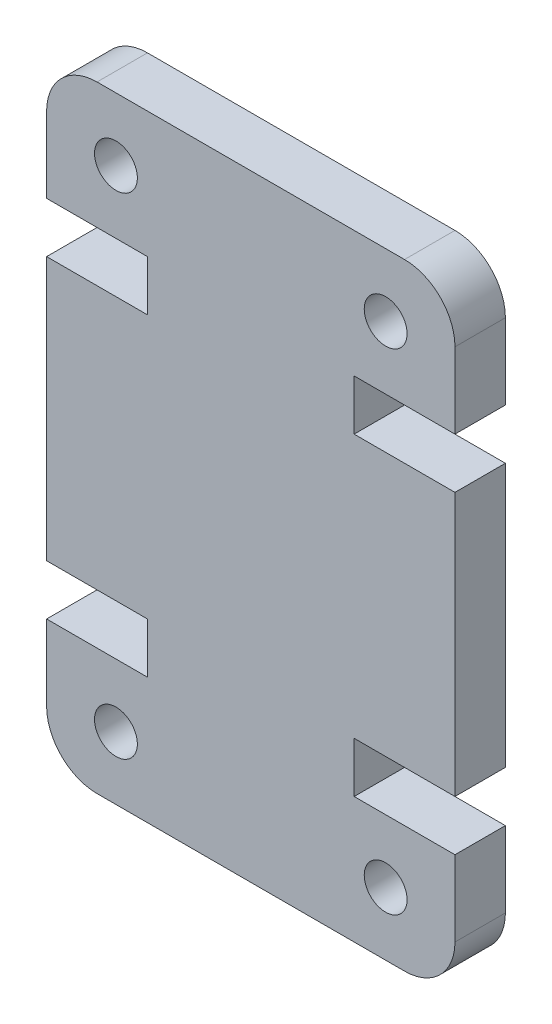
ISO-10303-21;
HEADER;
FILE_DESCRIPTION(('STEP AP214'),'2;1');
FILE_NAME('part.step','',(''),(''),'','','');
FILE_SCHEMA(('AUTOMOTIVE_DESIGN { 1 0 10303 214 1 1 1 1 }'));
ENDSEC;
DATA;
#1=APPLICATION_CONTEXT('core data for automotive mechanical design processes');
#2=APPLICATION_PROTOCOL_DEFINITION('international standard','automotive_design',2000,#1);
#3=PRODUCT_CONTEXT('',#1,'mechanical');
#4=PRODUCT('Part','Part','',(#3));
#5=PRODUCT_RELATED_PRODUCT_CATEGORY('part','',(#4));
#6=PRODUCT_DEFINITION_FORMATION('','',#4);
#7=PRODUCT_DEFINITION_CONTEXT('part definition',#1,'design');
#8=PRODUCT_DEFINITION('design','',#6,#7);
#9=PRODUCT_DEFINITION_SHAPE('','',#8);
#10=(LENGTH_UNIT() NAMED_UNIT(*) SI_UNIT(.MILLI.,.METRE.));
#11=(NAMED_UNIT(*) PLANE_ANGLE_UNIT() SI_UNIT($,.RADIAN.));
#12=(NAMED_UNIT(*) SI_UNIT($,.STERADIAN.) SOLID_ANGLE_UNIT());
#13=UNCERTAINTY_MEASURE_WITH_UNIT(LENGTH_MEASURE(1.E-05),#10,'distance_accuracy_value','');
#14=(GEOMETRIC_REPRESENTATION_CONTEXT(3) GLOBAL_UNCERTAINTY_ASSIGNED_CONTEXT((#13)) GLOBAL_UNIT_ASSIGNED_CONTEXT((#10,
#11,#12)) REPRESENTATION_CONTEXT('',''));
#15=CARTESIAN_POINT('',(0.,0.,0.));
#16=DIRECTION('',(0.,0.,1.));
#17=DIRECTION('',(1.,0.,0.));
#18=AXIS2_PLACEMENT_3D('',#15,#16,#17);
#19=CARTESIAN_POINT('',(14.2,2.,4.));
#20=DIRECTION('',(0.,0.,-1.));
#21=DIRECTION('',(-1.,0.,0.));
#22=AXIS2_PLACEMENT_3D('',#19,#20,#21);
#23=CYLINDRICAL_SURFACE('',#22,2.);
#24=CARTESIAN_POINT('',(14.2,2.,2.));
#25=DIRECTION('',(0.,0.,-1.));
#26=DIRECTION('',(-1.,0.,0.));
#27=AXIS2_PLACEMENT_3D('',#24,#25,#26);
#28=CIRCLE('',#27,2.);
#29=CARTESIAN_POINT('',(16.2,2.00000000000001,2.));
#30=VERTEX_POINT('',#29);
#31=CARTESIAN_POINT('',(14.2,0.,2.));
#32=VERTEX_POINT('',#31);
#33=EDGE_CURVE('E47',#30,#32,#28,.T.);
#34=ORIENTED_EDGE('',*,*,#33,.F.);
#35=DIRECTION('',(0.,0.,-1.));
#36=VECTOR('',#35,1.);
#37=CARTESIAN_POINT('',(16.2,2.,4.));
#38=LINE('',#37,#36);
#39=CARTESIAN_POINT('',(16.2,2.,4.));
#40=VERTEX_POINT('',#39);
#41=EDGE_CURVE('E11',#40,#30,#38,.T.);
#42=ORIENTED_EDGE('',*,*,#41,.F.);
#43=CARTESIAN_POINT('',(14.2,2.,4.));
#44=DIRECTION('',(0.,0.,1.));
#45=DIRECTION('',(-1.,0.,0.));
#46=AXIS2_PLACEMENT_3D('',#43,#44,#45);
#47=CIRCLE('',#46,2.);
#48=CARTESIAN_POINT('',(14.2,0.,4.));
#49=VERTEX_POINT('',#48);
#50=EDGE_CURVE('E352',#49,#40,#47,.T.);
#51=ORIENTED_EDGE('',*,*,#50,.F.);
#52=DIRECTION('',(0.,0.,-1.));
#53=VECTOR('',#52,1.);
#54=CARTESIAN_POINT('',(14.2,0.,4.));
#55=LINE('',#54,#53);
#56=EDGE_CURVE('E213',#49,#32,#55,.T.);
#57=ORIENTED_EDGE('',*,*,#56,.T.);
#58=EDGE_LOOP('',(#34,#42,#51,#57));
#59=FACE_BOUND('',#58,.T.);
#60=ADVANCED_FACE('F32',(#59),#23,.T.);
#61=CARTESIAN_POINT('',(16.2,5.00000000000014,4.));
#62=DIRECTION('',(-1.,0.,0.));
#63=DIRECTION('',(0.,0.,1.));
#64=AXIS2_PLACEMENT_3D('',#61,#62,#63);
#65=PLANE('',#64);
#66=DIRECTION('',(0.,-1.,0.));
#67=VECTOR('',#66,1.);
#68=CARTESIAN_POINT('',(16.2,24.45,2.));
#69=LINE('',#68,#67);
#70=CARTESIAN_POINT('',(16.2,5.00000000000014,2.));
#71=VERTEX_POINT('',#70);
#72=EDGE_CURVE('E289',#71,#30,#69,.T.);
#73=ORIENTED_EDGE('',*,*,#72,.F.);
#74=DIRECTION('',(0.,0.,-1.));
#75=VECTOR('',#74,1.);
#76=CARTESIAN_POINT('',(16.2,5.00000000000014,4.));
#77=LINE('',#76,#75);
#78=CARTESIAN_POINT('',(16.2,5.00000000000014,4.));
#79=VERTEX_POINT('',#78);
#80=EDGE_CURVE('E40',#79,#71,#77,.T.);
#81=ORIENTED_EDGE('',*,*,#80,.F.);
#82=DIRECTION('',(0.,1.,0.));
#83=VECTOR('',#82,1.);
#84=CARTESIAN_POINT('',(16.2,5.00000000000014,4.));
#85=LINE('',#84,#83);
#86=EDGE_CURVE('E288',#40,#79,#85,.T.);
#87=ORIENTED_EDGE('',*,*,#86,.F.);
#88=ORIENTED_EDGE('',*,*,#41,.T.);
#89=EDGE_LOOP('',(#73,#81,#87,#88));
#90=FACE_BOUND('',#89,.T.);
#91=ADVANCED_FACE('F287',(#90),#65,.F.);
#92=CARTESIAN_POINT('',(12.2,5.00000000000014,4.));
#93=DIRECTION('',(0.,-1.,0.));
#94=DIRECTION('',(0.,0.,-1.));
#95=AXIS2_PLACEMENT_3D('',#92,#93,#94);
#96=PLANE('',#95);
#97=DIRECTION('',(1.,0.,0.));
#98=VECTOR('',#97,1.);
#99=CARTESIAN_POINT('',(12.2,5.00000000000014,2.));
#100=LINE('',#99,#98);
#101=CARTESIAN_POINT('',(12.2,5.00000000000014,2.));
#102=VERTEX_POINT('',#101);
#103=EDGE_CURVE('E283',#102,#71,#100,.T.);
#104=ORIENTED_EDGE('',*,*,#103,.F.);
#105=DIRECTION('',(0.,0.,-1.));
#106=VECTOR('',#105,1.);
#107=CARTESIAN_POINT('',(12.2,5.00000000000014,4.));
#108=LINE('',#107,#106);
#109=CARTESIAN_POINT('',(12.2,5.00000000000014,4.));
#110=VERTEX_POINT('',#109);
#111=EDGE_CURVE('E273',#110,#102,#108,.T.);
#112=ORIENTED_EDGE('',*,*,#111,.F.);
#113=DIRECTION('',(-1.,0.,0.));
#114=VECTOR('',#113,1.);
#115=CARTESIAN_POINT('',(12.2,5.00000000000014,4.));
#116=LINE('',#115,#114);
#117=EDGE_CURVE('E284',#79,#110,#116,.T.);
#118=ORIENTED_EDGE('',*,*,#117,.F.);
#119=ORIENTED_EDGE('',*,*,#80,.T.);
#120=EDGE_LOOP('',(#104,#112,#118,#119));
#121=FACE_BOUND('',#120,.T.);
#122=ADVANCED_FACE('F281',(#121),#96,.F.);
#123=CARTESIAN_POINT('',(12.2,7.00000000000014,4.));
#124=DIRECTION('',(-1.,0.,0.));
#125=DIRECTION('',(0.,0.,1.));
#126=AXIS2_PLACEMENT_3D('',#123,#124,#125);
#127=PLANE('',#126);
#128=DIRECTION('',(0.,-1.,0.));
#129=VECTOR('',#128,1.);
#130=CARTESIAN_POINT('',(12.2,7.00000000000014,2.));
#131=LINE('',#130,#129);
#132=CARTESIAN_POINT('',(12.2,7.00000000000014,2.));
#133=VERTEX_POINT('',#132);
#134=EDGE_CURVE('E336',#133,#102,#131,.T.);
#135=ORIENTED_EDGE('',*,*,#134,.F.);
#136=DIRECTION('',(0.,0.,-1.));
#137=VECTOR('',#136,1.);
#138=CARTESIAN_POINT('',(12.2,7.00000000000014,4.));
#139=LINE('',#138,#137);
#140=CARTESIAN_POINT('',(12.2,7.00000000000014,4.));
#141=VERTEX_POINT('',#140);
#142=EDGE_CURVE('E270',#141,#133,#139,.T.);
#143=ORIENTED_EDGE('',*,*,#142,.F.);
#144=DIRECTION('',(0.,1.,0.));
#145=VECTOR('',#144,1.);
#146=CARTESIAN_POINT('',(12.2,7.00000000000014,4.));
#147=LINE('',#146,#145);
#148=EDGE_CURVE('E356',#110,#141,#147,.T.);
#149=ORIENTED_EDGE('',*,*,#148,.F.);
#150=ORIENTED_EDGE('',*,*,#111,.T.);
#151=EDGE_LOOP('',(#135,#143,#149,#150));
#152=FACE_BOUND('',#151,.T.);
#153=ADVANCED_FACE('F459',(#152),#127,.F.);
#154=CARTESIAN_POINT('',(16.2,7.00000000000014,4.));
#155=DIRECTION('',(0.,1.,0.));
#156=DIRECTION('',(-1.,0.,0.));
#157=AXIS2_PLACEMENT_3D('',#154,#155,#156);
#158=PLANE('',#157);
#159=DIRECTION('',(-1.,0.,0.));
#160=VECTOR('',#159,1.);
#161=CARTESIAN_POINT('',(16.2,7.00000000000014,2.));
#162=LINE('',#161,#160);
#163=CARTESIAN_POINT('',(16.2,7.00000000000014,2.));
#164=VERTEX_POINT('',#163);
#165=EDGE_CURVE('E334',#164,#133,#162,.T.);
#166=ORIENTED_EDGE('',*,*,#165,.F.);
#167=DIRECTION('',(0.,0.,-1.));
#168=VECTOR('',#167,1.);
#169=CARTESIAN_POINT('',(16.2,7.00000000000014,4.));
#170=LINE('',#169,#168);
#171=CARTESIAN_POINT('',(16.2,7.00000000000014,4.));
#172=VERTEX_POINT('',#171);
#173=EDGE_CURVE('E267',#172,#164,#170,.T.);
#174=ORIENTED_EDGE('',*,*,#173,.F.);
#175=DIRECTION('',(1.,0.,0.));
#176=VECTOR('',#175,1.);
#177=CARTESIAN_POINT('',(16.2,7.00000000000014,4.));
#178=LINE('',#177,#176);
#179=EDGE_CURVE('E358',#141,#172,#178,.T.);
#180=ORIENTED_EDGE('',*,*,#179,.F.);
#181=ORIENTED_EDGE('',*,*,#142,.T.);
#182=EDGE_LOOP('',(#166,#174,#180,#181));
#183=FACE_BOUND('',#182,.T.);
#184=ADVANCED_FACE('F455',(#183),#158,.F.);
#185=CARTESIAN_POINT('',(16.2,17.4499999999999,4.));
#186=DIRECTION('',(-1.,0.,0.));
#187=DIRECTION('',(0.,0.,1.));
#188=AXIS2_PLACEMENT_3D('',#185,#186,#187);
#189=PLANE('',#188);
#190=CARTESIAN_POINT('',(16.2,17.4499999999999,2.));
#191=VERTEX_POINT('',#190);
#192=EDGE_CURVE('E291',#191,#164,#69,.T.);
#193=ORIENTED_EDGE('',*,*,#192,.F.);
#194=DIRECTION('',(0.,0.,-1.));
#195=VECTOR('',#194,1.);
#196=CARTESIAN_POINT('',(16.2,17.4499999999999,4.));
#197=LINE('',#196,#195);
#198=CARTESIAN_POINT('',(16.2,17.4499999999999,4.));
#199=VERTEX_POINT('',#198);
#200=EDGE_CURVE('E264',#199,#191,#197,.T.);
#201=ORIENTED_EDGE('',*,*,#200,.F.);
#202=DIRECTION('',(0.,1.,0.));
#203=VECTOR('',#202,1.);
#204=CARTESIAN_POINT('',(16.2,17.4499999999999,4.));
#205=LINE('',#204,#203);
#206=EDGE_CURVE('E360',#172,#199,#205,.T.);
#207=ORIENTED_EDGE('',*,*,#206,.F.);
#208=ORIENTED_EDGE('',*,*,#173,.T.);
#209=EDGE_LOOP('',(#193,#201,#207,#208));
#210=FACE_BOUND('',#209,.T.);
#211=ADVANCED_FACE('F450',(#210),#189,.F.);
#212=CARTESIAN_POINT('',(16.2,17.4499999999999,4.));
#213=DIRECTION('',(0.,-1.,0.));
#214=DIRECTION('',(1.,0.,0.));
#215=AXIS2_PLACEMENT_3D('',#212,#213,#214);
#216=PLANE('',#215);
#217=DIRECTION('',(1.,0.,0.));
#218=VECTOR('',#217,1.);
#219=CARTESIAN_POINT('',(16.2,17.4499999999999,2.));
#220=LINE('',#219,#218);
#221=CARTESIAN_POINT('',(12.2,17.4499999999999,2.));
#222=VERTEX_POINT('',#221);
#223=EDGE_CURVE('E332',#222,#191,#220,.T.);
#224=ORIENTED_EDGE('',*,*,#223,.F.);
#225=DIRECTION('',(0.,0.,-1.));
#226=VECTOR('',#225,1.);
#227=CARTESIAN_POINT('',(12.2,17.4499999999999,4.));
#228=LINE('',#227,#226);
#229=CARTESIAN_POINT('',(12.2,17.4499999999999,4.));
#230=VERTEX_POINT('',#229);
#231=EDGE_CURVE('E261',#230,#222,#228,.T.);
#232=ORIENTED_EDGE('',*,*,#231,.F.);
#233=DIRECTION('',(-1.,0.,0.));
#234=VECTOR('',#233,1.);
#235=CARTESIAN_POINT('',(16.2,17.4499999999999,4.));
#236=LINE('',#235,#234);
#237=EDGE_CURVE('E362',#199,#230,#236,.T.);
#238=ORIENTED_EDGE('',*,*,#237,.F.);
#239=ORIENTED_EDGE('',*,*,#200,.T.);
#240=EDGE_LOOP('',(#224,#232,#238,#239));
#241=FACE_BOUND('',#240,.T.);
#242=ADVANCED_FACE('F445',(#241),#216,.F.);
#243=CARTESIAN_POINT('',(12.2,17.4499999999999,4.));
#244=DIRECTION('',(-1.,0.,0.));
#245=DIRECTION('',(0.,0.,1.));
#246=AXIS2_PLACEMENT_3D('',#243,#244,#245);
#247=PLANE('',#246);
#248=DIRECTION('',(0.,-1.,0.));
#249=VECTOR('',#248,1.);
#250=CARTESIAN_POINT('',(12.2,17.4499999999999,2.));
#251=LINE('',#250,#249);
#252=CARTESIAN_POINT('',(12.2,19.4499999999999,2.));
#253=VERTEX_POINT('',#252);
#254=EDGE_CURVE('E330',#253,#222,#251,.T.);
#255=ORIENTED_EDGE('',*,*,#254,.F.);
#256=DIRECTION('',(0.,0.,-1.));
#257=VECTOR('',#256,1.);
#258=CARTESIAN_POINT('',(12.2,19.4499999999999,4.));
#259=LINE('',#258,#257);
#260=CARTESIAN_POINT('',(12.2,19.4499999999999,4.));
#261=VERTEX_POINT('',#260);
#262=EDGE_CURVE('E258',#261,#253,#259,.T.);
#263=ORIENTED_EDGE('',*,*,#262,.F.);
#264=DIRECTION('',(0.,1.,0.));
#265=VECTOR('',#264,1.);
#266=CARTESIAN_POINT('',(12.2,17.4499999999999,4.));
#267=LINE('',#266,#265);
#268=EDGE_CURVE('E364',#230,#261,#267,.T.);
#269=ORIENTED_EDGE('',*,*,#268,.F.);
#270=ORIENTED_EDGE('',*,*,#231,.T.);
#271=EDGE_LOOP('',(#255,#263,#269,#270));
#272=FACE_BOUND('',#271,.T.);
#273=ADVANCED_FACE('F440',(#272),#247,.F.);
#274=CARTESIAN_POINT('',(12.2,19.4499999999999,4.));
#275=DIRECTION('',(0.,1.,0.));
#276=DIRECTION('',(0.,0.,1.));
#277=AXIS2_PLACEMENT_3D('',#274,#275,#276);
#278=PLANE('',#277);
#279=DIRECTION('',(-1.,0.,0.));
#280=VECTOR('',#279,1.);
#281=CARTESIAN_POINT('',(12.2,19.4499999999999,2.));
#282=LINE('',#281,#280);
#283=CARTESIAN_POINT('',(16.2,19.4499999999999,2.));
#284=VERTEX_POINT('',#283);
#285=EDGE_CURVE('E328',#284,#253,#282,.T.);
#286=ORIENTED_EDGE('',*,*,#285,.F.);
#287=DIRECTION('',(0.,0.,-1.));
#288=VECTOR('',#287,1.);
#289=CARTESIAN_POINT('',(16.2,19.4499999999999,4.));
#290=LINE('',#289,#288);
#291=CARTESIAN_POINT('',(16.2,19.4499999999999,4.));
#292=VERTEX_POINT('',#291);
#293=EDGE_CURVE('E255',#292,#284,#290,.T.);
#294=ORIENTED_EDGE('',*,*,#293,.F.);
#295=DIRECTION('',(1.,0.,0.));
#296=VECTOR('',#295,1.);
#297=CARTESIAN_POINT('',(12.2,19.4499999999999,4.));
#298=LINE('',#297,#296);
#299=EDGE_CURVE('E366',#261,#292,#298,.T.);
#300=ORIENTED_EDGE('',*,*,#299,.F.);
#301=ORIENTED_EDGE('',*,*,#262,.T.);
#302=EDGE_LOOP('',(#286,#294,#300,#301));
#303=FACE_BOUND('',#302,.T.);
#304=ADVANCED_FACE('F435',(#303),#278,.F.);
#305=CARTESIAN_POINT('',(16.2,19.4499999999999,4.));
#306=DIRECTION('',(-1.,0.,0.));
#307=DIRECTION('',(0.,0.,1.));
#308=AXIS2_PLACEMENT_3D('',#305,#306,#307);
#309=PLANE('',#308);
#310=CARTESIAN_POINT('',(16.2,22.45,2.));
#311=VERTEX_POINT('',#310);
#312=EDGE_CURVE('E294',#311,#284,#69,.T.);
#313=ORIENTED_EDGE('',*,*,#312,.F.);
#314=DIRECTION('',(0.,0.,-1.));
#315=VECTOR('',#314,1.);
#316=CARTESIAN_POINT('',(16.2,22.45,4.));
#317=LINE('',#316,#315);
#318=CARTESIAN_POINT('',(16.2,22.45,4.));
#319=VERTEX_POINT('',#318);
#320=EDGE_CURVE('E252',#319,#311,#317,.T.);
#321=ORIENTED_EDGE('',*,*,#320,.F.);
#322=DIRECTION('',(0.,1.,0.));
#323=VECTOR('',#322,1.);
#324=CARTESIAN_POINT('',(16.2,19.4499999999999,4.));
#325=LINE('',#324,#323);
#326=EDGE_CURVE('E368',#292,#319,#325,.T.);
#327=ORIENTED_EDGE('',*,*,#326,.F.);
#328=ORIENTED_EDGE('',*,*,#293,.T.);
#329=EDGE_LOOP('',(#313,#321,#327,#328));
#330=FACE_BOUND('',#329,.T.);
#331=ADVANCED_FACE('F431',(#330),#309,.F.);
#332=CARTESIAN_POINT('',(14.2,22.45,4.));
#333=DIRECTION('',(0.,0.,-1.));
#334=DIRECTION('',(-1.,0.,0.));
#335=AXIS2_PLACEMENT_3D('',#332,#333,#334);
#336=CYLINDRICAL_SURFACE('',#335,2.);
#337=CARTESIAN_POINT('',(14.2,22.45,2.));
#338=DIRECTION('',(0.,0.,-1.));
#339=DIRECTION('',(-1.,0.,0.));
#340=AXIS2_PLACEMENT_3D('',#337,#338,#339);
#341=CIRCLE('',#340,2.);
#342=CARTESIAN_POINT('',(14.2,24.45,2.));
#343=VERTEX_POINT('',#342);
#344=EDGE_CURVE('E326',#343,#311,#341,.T.);
#345=ORIENTED_EDGE('',*,*,#344,.F.);
#346=DIRECTION('',(0.,0.,-1.));
#347=VECTOR('',#346,1.);
#348=CARTESIAN_POINT('',(14.2,24.45,4.));
#349=LINE('',#348,#347);
#350=CARTESIAN_POINT('',(14.2,24.45,4.));
#351=VERTEX_POINT('',#350);
#352=EDGE_CURVE('E249',#351,#343,#349,.T.);
#353=ORIENTED_EDGE('',*,*,#352,.F.);
#354=CARTESIAN_POINT('',(14.2,22.45,4.));
#355=DIRECTION('',(0.,0.,1.));
#356=DIRECTION('',(1.,0.,0.));
#357=AXIS2_PLACEMENT_3D('',#354,#355,#356);
#358=CIRCLE('',#357,2.);
#359=EDGE_CURVE('E370',#319,#351,#358,.T.);
#360=ORIENTED_EDGE('',*,*,#359,.F.);
#361=ORIENTED_EDGE('',*,*,#320,.T.);
#362=EDGE_LOOP('',(#345,#353,#360,#361));
#363=FACE_BOUND('',#362,.T.);
#364=ADVANCED_FACE('F427',(#363),#336,.T.);
#365=CARTESIAN_POINT('',(1.99999999999999,24.45,4.));
#366=DIRECTION('',(0.,-1.,0.));
#367=DIRECTION('',(0.,0.,-1.));
#368=AXIS2_PLACEMENT_3D('',#365,#366,#367);
#369=PLANE('',#368);
#370=DIRECTION('',(1.,0.,0.));
#371=VECTOR('',#370,1.);
#372=CARTESIAN_POINT('',(0.,24.45,2.));
#373=LINE('',#372,#371);
#374=CARTESIAN_POINT('',(2.,24.45,2.));
#375=VERTEX_POINT('',#374);
#376=EDGE_CURVE('E292',#375,#343,#373,.T.);
#377=ORIENTED_EDGE('',*,*,#376,.F.);
#378=DIRECTION('',(0.,0.,-1.));
#379=VECTOR('',#378,1.);
#380=CARTESIAN_POINT('',(1.99999999999999,24.45,4.));
#381=LINE('',#380,#379);
#382=CARTESIAN_POINT('',(1.99999999999999,24.45,4.));
#383=VERTEX_POINT('',#382);
#384=EDGE_CURVE('E246',#383,#375,#381,.T.);
#385=ORIENTED_EDGE('',*,*,#384,.F.);
#386=DIRECTION('',(-1.,0.,0.));
#387=VECTOR('',#386,1.);
#388=CARTESIAN_POINT('',(1.99999999999999,24.45,4.));
#389=LINE('',#388,#387);
#390=EDGE_CURVE('E372',#351,#383,#389,.T.);
#391=ORIENTED_EDGE('',*,*,#390,.F.);
#392=ORIENTED_EDGE('',*,*,#352,.T.);
#393=EDGE_LOOP('',(#377,#385,#391,#392));
#394=FACE_BOUND('',#393,.T.);
#395=ADVANCED_FACE('F424',(#394),#369,.F.);
#396=CARTESIAN_POINT('',(2.,22.45,4.));
#397=DIRECTION('',(0.,0.,-1.));
#398=DIRECTION('',(-1.,0.,0.));
#399=AXIS2_PLACEMENT_3D('',#396,#397,#398);
#400=CYLINDRICAL_SURFACE('',#399,2.);
#401=CARTESIAN_POINT('',(2.,22.45,2.));
#402=DIRECTION('',(0.,0.,-1.));
#403=DIRECTION('',(-1.,0.,0.));
#404=AXIS2_PLACEMENT_3D('',#401,#402,#403);
#405=CIRCLE('',#404,2.);
#406=CARTESIAN_POINT('',(0.,22.45,2.));
#407=VERTEX_POINT('',#406);
#408=EDGE_CURVE('E324',#407,#375,#405,.T.);
#409=ORIENTED_EDGE('',*,*,#408,.F.);
#410=DIRECTION('',(0.,0.,-1.));
#411=VECTOR('',#410,1.);
#412=CARTESIAN_POINT('',(0.,22.45,4.));
#413=LINE('',#412,#411);
#414=CARTESIAN_POINT('',(0.,22.45,4.));
#415=VERTEX_POINT('',#414);
#416=EDGE_CURVE('E243',#415,#407,#413,.T.);
#417=ORIENTED_EDGE('',*,*,#416,.F.);
#418=CARTESIAN_POINT('',(2.,22.45,4.));
#419=DIRECTION('',(0.,0.,1.));
#420=DIRECTION('',(-1.,0.,0.));
#421=AXIS2_PLACEMENT_3D('',#418,#419,#420);
#422=CIRCLE('',#421,2.);
#423=EDGE_CURVE('E374',#383,#415,#422,.T.);
#424=ORIENTED_EDGE('',*,*,#423,.F.);
#425=ORIENTED_EDGE('',*,*,#384,.T.);
#426=EDGE_LOOP('',(#409,#417,#424,#425));
#427=FACE_BOUND('',#426,.T.);
#428=ADVANCED_FACE('F413',(#427),#400,.T.);
#429=CARTESIAN_POINT('',(0.,19.4499999999999,4.));
#430=DIRECTION('',(1.,0.,0.));
#431=DIRECTION('',(0.,1.,0.));
#432=AXIS2_PLACEMENT_3D('',#429,#430,#431);
#433=PLANE('',#432);
#434=DIRECTION('',(0.,1.,0.));
#435=VECTOR('',#434,1.);
#436=CARTESIAN_POINT('',(0.,0.,2.));
#437=LINE('',#436,#435);
#438=CARTESIAN_POINT('',(0.,19.4499999999999,2.));
#439=VERTEX_POINT('',#438);
#440=EDGE_CURVE('E199',#439,#407,#437,.T.);
#441=ORIENTED_EDGE('',*,*,#440,.F.);
#442=DIRECTION('',(0.,0.,-1.));
#443=VECTOR('',#442,1.);
#444=CARTESIAN_POINT('',(0.,19.4499999999999,4.));
#445=LINE('',#444,#443);
#446=CARTESIAN_POINT('',(0.,19.4499999999999,4.));
#447=VERTEX_POINT('',#446);
#448=EDGE_CURVE('E240',#447,#439,#445,.T.);
#449=ORIENTED_EDGE('',*,*,#448,.F.);
#450=DIRECTION('',(0.,-1.,0.));
#451=VECTOR('',#450,1.);
#452=CARTESIAN_POINT('',(0.,19.4499999999999,4.));
#453=LINE('',#452,#451);
#454=EDGE_CURVE('E376',#415,#447,#453,.T.);
#455=ORIENTED_EDGE('',*,*,#454,.F.);
#456=ORIENTED_EDGE('',*,*,#416,.T.);
#457=EDGE_LOOP('',(#441,#449,#455,#456));
#458=FACE_BOUND('',#457,.T.);
#459=ADVANCED_FACE('F417',(#458),#433,.F.);
#460=CARTESIAN_POINT('',(3.99999999999999,19.4499999999999,4.));
#461=DIRECTION('',(0.,1.,0.));
#462=DIRECTION('',(-1.,0.,0.));
#463=AXIS2_PLACEMENT_3D('',#460,#461,#462);
#464=PLANE('',#463);
#465=DIRECTION('',(-1.,0.,0.));
#466=VECTOR('',#465,1.);
#467=CARTESIAN_POINT('',(3.99999999999999,19.4499999999999,2.));
#468=LINE('',#467,#466);
#469=CARTESIAN_POINT('',(3.99999999999999,19.4499999999999,2.));
#470=VERTEX_POINT('',#469);
#471=EDGE_CURVE('E322',#470,#439,#468,.T.);
#472=ORIENTED_EDGE('',*,*,#471,.F.);
#473=DIRECTION('',(0.,0.,-1.));
#474=VECTOR('',#473,1.);
#475=CARTESIAN_POINT('',(3.99999999999999,19.4499999999999,4.));
#476=LINE('',#475,#474);
#477=CARTESIAN_POINT('',(3.99999999999999,19.4499999999999,4.));
#478=VERTEX_POINT('',#477);
#479=EDGE_CURVE('E237',#478,#470,#476,.T.);
#480=ORIENTED_EDGE('',*,*,#479,.F.);
#481=DIRECTION('',(1.,0.,0.));
#482=VECTOR('',#481,1.);
#483=CARTESIAN_POINT('',(3.99999999999999,19.4499999999999,4.));
#484=LINE('',#483,#482);
#485=EDGE_CURVE('E378',#447,#478,#484,.T.);
#486=ORIENTED_EDGE('',*,*,#485,.F.);
#487=ORIENTED_EDGE('',*,*,#448,.T.);
#488=EDGE_LOOP('',(#472,#480,#486,#487));
#489=FACE_BOUND('',#488,.T.);
#490=ADVANCED_FACE('F494',(#489),#464,.F.);
#491=CARTESIAN_POINT('',(3.99999999999999,17.4499999999999,4.));
#492=DIRECTION('',(1.,0.,0.));
#493=DIRECTION('',(0.,0.,-1.));
#494=AXIS2_PLACEMENT_3D('',#491,#492,#493);
#495=PLANE('',#494);
#496=DIRECTION('',(0.,1.,0.));
#497=VECTOR('',#496,1.);
#498=CARTESIAN_POINT('',(3.99999999999999,17.4499999999999,2.));
#499=LINE('',#498,#497);
#500=CARTESIAN_POINT('',(3.99999999999999,17.4499999999999,2.));
#501=VERTEX_POINT('',#500);
#502=EDGE_CURVE('E320',#501,#470,#499,.T.);
#503=ORIENTED_EDGE('',*,*,#502,.F.);
#504=DIRECTION('',(0.,0.,-1.));
#505=VECTOR('',#504,1.);
#506=CARTESIAN_POINT('',(3.99999999999999,17.4499999999999,4.));
#507=LINE('',#506,#505);
#508=CARTESIAN_POINT('',(3.99999999999999,17.4499999999999,4.));
#509=VERTEX_POINT('',#508);
#510=EDGE_CURVE('E234',#509,#501,#507,.T.);
#511=ORIENTED_EDGE('',*,*,#510,.F.);
#512=DIRECTION('',(0.,-1.,0.));
#513=VECTOR('',#512,1.);
#514=CARTESIAN_POINT('',(3.99999999999999,17.4499999999999,4.));
#515=LINE('',#514,#513);
#516=EDGE_CURVE('E380',#478,#509,#515,.T.);
#517=ORIENTED_EDGE('',*,*,#516,.F.);
#518=ORIENTED_EDGE('',*,*,#479,.T.);
#519=EDGE_LOOP('',(#503,#511,#517,#518));
#520=FACE_BOUND('',#519,.T.);
#521=ADVANCED_FACE('F497',(#520),#495,.F.);
#522=CARTESIAN_POINT('',(0.,17.4499999999999,4.));
#523=DIRECTION('',(0.,-1.,0.));
#524=DIRECTION('',(1.,0.,0.));
#525=AXIS2_PLACEMENT_3D('',#522,#523,#524);
#526=PLANE('',#525);
#527=DIRECTION('',(1.,0.,0.));
#528=VECTOR('',#527,1.);
#529=CARTESIAN_POINT('',(0.,17.4499999999999,2.));
#530=LINE('',#529,#528);
#531=CARTESIAN_POINT('',(0.,17.4499999999999,2.));
#532=VERTEX_POINT('',#531);
#533=EDGE_CURVE('E318',#532,#501,#530,.T.);
#534=ORIENTED_EDGE('',*,*,#533,.F.);
#535=DIRECTION('',(0.,0.,-1.));
#536=VECTOR('',#535,1.);
#537=CARTESIAN_POINT('',(0.,17.4499999999999,4.));
#538=LINE('',#537,#536);
#539=CARTESIAN_POINT('',(0.,17.4499999999999,4.));
#540=VERTEX_POINT('',#539);
#541=EDGE_CURVE('E231',#540,#532,#538,.T.);
#542=ORIENTED_EDGE('',*,*,#541,.F.);
#543=DIRECTION('',(-1.,0.,0.));
#544=VECTOR('',#543,1.);
#545=CARTESIAN_POINT('',(0.,17.4499999999999,4.));
#546=LINE('',#545,#544);
#547=EDGE_CURVE('E382',#509,#540,#546,.T.);
#548=ORIENTED_EDGE('',*,*,#547,.F.);
#549=ORIENTED_EDGE('',*,*,#510,.T.);
#550=EDGE_LOOP('',(#534,#542,#548,#549));
#551=FACE_BOUND('',#550,.T.);
#552=ADVANCED_FACE('F501',(#551),#526,.F.);
#553=CARTESIAN_POINT('',(0.,17.4499999999999,4.));
#554=DIRECTION('',(1.,0.,0.));
#555=DIRECTION('',(0.,0.,-1.));
#556=AXIS2_PLACEMENT_3D('',#553,#554,#555);
#557=PLANE('',#556);
#558=CARTESIAN_POINT('',(0.,7.00000000000013,2.));
#559=VERTEX_POINT('',#558);
#560=EDGE_CURVE('E403',#559,#532,#437,.T.);
#561=ORIENTED_EDGE('',*,*,#560,.F.);
#562=DIRECTION('',(0.,0.,-1.));
#563=VECTOR('',#562,1.);
#564=CARTESIAN_POINT('',(0.,7.00000000000012,4.));
#565=LINE('',#564,#563);
#566=CARTESIAN_POINT('',(0.,7.00000000000012,4.));
#567=VERTEX_POINT('',#566);
#568=EDGE_CURVE('E228',#567,#559,#565,.T.);
#569=ORIENTED_EDGE('',*,*,#568,.F.);
#570=DIRECTION('',(0.,-1.,0.));
#571=VECTOR('',#570,1.);
#572=CARTESIAN_POINT('',(0.,17.4499999999999,4.));
#573=LINE('',#572,#571);
#574=EDGE_CURVE('E384',#540,#567,#573,.T.);
#575=ORIENTED_EDGE('',*,*,#574,.F.);
#576=ORIENTED_EDGE('',*,*,#541,.T.);
#577=EDGE_LOOP('',(#561,#569,#575,#576));
#578=FACE_BOUND('',#577,.T.);
#579=ADVANCED_FACE('F505',(#578),#557,.F.);
#580=CARTESIAN_POINT('',(0.,7.00000000000012,4.));
#581=DIRECTION('',(0.,1.,0.));
#582=DIRECTION('',(-1.,0.,0.));
#583=AXIS2_PLACEMENT_3D('',#580,#581,#582);
#584=PLANE('',#583);
#585=DIRECTION('',(-1.,0.,0.));
#586=VECTOR('',#585,1.);
#587=CARTESIAN_POINT('',(0.,7.00000000000012,2.));
#588=LINE('',#587,#586);
#589=CARTESIAN_POINT('',(4.,7.00000000000014,2.));
#590=VERTEX_POINT('',#589);
#591=EDGE_CURVE('E316',#590,#559,#588,.T.);
#592=ORIENTED_EDGE('',*,*,#591,.F.);
#593=DIRECTION('',(0.,0.,-1.));
#594=VECTOR('',#593,1.);
#595=CARTESIAN_POINT('',(4.,7.00000000000014,4.));
#596=LINE('',#595,#594);
#597=CARTESIAN_POINT('',(4.,7.00000000000014,4.));
#598=VERTEX_POINT('',#597);
#599=EDGE_CURVE('E225',#598,#590,#596,.T.);
#600=ORIENTED_EDGE('',*,*,#599,.F.);
#601=DIRECTION('',(1.,0.,0.));
#602=VECTOR('',#601,1.);
#603=CARTESIAN_POINT('',(0.,7.00000000000012,4.));
#604=LINE('',#603,#602);
#605=EDGE_CURVE('E386',#567,#598,#604,.T.);
#606=ORIENTED_EDGE('',*,*,#605,.F.);
#607=ORIENTED_EDGE('',*,*,#568,.T.);
#608=EDGE_LOOP('',(#592,#600,#606,#607));
#609=FACE_BOUND('',#608,.T.);
#610=ADVANCED_FACE('F509',(#609),#584,.F.);
#611=CARTESIAN_POINT('',(4.,7.00000000000014,4.));
#612=DIRECTION('',(1.,0.,0.));
#613=DIRECTION('',(0.,0.,-1.));
#614=AXIS2_PLACEMENT_3D('',#611,#612,#613);
#615=PLANE('',#614);
#616=DIRECTION('',(0.,1.,0.));
#617=VECTOR('',#616,1.);
#618=CARTESIAN_POINT('',(4.,7.00000000000014,2.));
#619=LINE('',#618,#617);
#620=CARTESIAN_POINT('',(4.,5.00000000000014,2.));
#621=VERTEX_POINT('',#620);
#622=EDGE_CURVE('E314',#621,#590,#619,.T.);
#623=ORIENTED_EDGE('',*,*,#622,.F.);
#624=DIRECTION('',(0.,0.,-1.));
#625=VECTOR('',#624,1.);
#626=CARTESIAN_POINT('',(4.,5.00000000000014,4.));
#627=LINE('',#626,#625);
#628=CARTESIAN_POINT('',(4.,5.00000000000014,4.));
#629=VERTEX_POINT('',#628);
#630=EDGE_CURVE('E222',#629,#621,#627,.T.);
#631=ORIENTED_EDGE('',*,*,#630,.F.);
#632=DIRECTION('',(0.,-1.,0.));
#633=VECTOR('',#632,1.);
#634=CARTESIAN_POINT('',(4.,7.00000000000014,4.));
#635=LINE('',#634,#633);
#636=EDGE_CURVE('E388',#598,#629,#635,.T.);
#637=ORIENTED_EDGE('',*,*,#636,.F.);
#638=ORIENTED_EDGE('',*,*,#599,.T.);
#639=EDGE_LOOP('',(#623,#631,#637,#638));
#640=FACE_BOUND('',#639,.T.);
#641=ADVANCED_FACE('F513',(#640),#615,.F.);
#642=CARTESIAN_POINT('',(4.,5.00000000000014,4.));
#643=DIRECTION('',(0.,-1.,0.));
#644=DIRECTION('',(1.,0.,0.));
#645=AXIS2_PLACEMENT_3D('',#642,#643,#644);
#646=PLANE('',#645);
#647=DIRECTION('',(1.,0.,0.));
#648=VECTOR('',#647,1.);
#649=CARTESIAN_POINT('',(4.,5.00000000000014,2.));
#650=LINE('',#649,#648);
#651=CARTESIAN_POINT('',(0.,5.00000000000014,2.));
#652=VERTEX_POINT('',#651);
#653=EDGE_CURVE('E209',#652,#621,#650,.T.);
#654=ORIENTED_EDGE('',*,*,#653,.F.);
#655=DIRECTION('',(0.,0.,-1.));
#656=VECTOR('',#655,1.);
#657=CARTESIAN_POINT('',(0.,5.00000000000014,4.));
#658=LINE('',#657,#656);
#659=CARTESIAN_POINT('',(0.,5.00000000000014,4.));
#660=VERTEX_POINT('',#659);
#661=EDGE_CURVE('E215',#660,#652,#658,.T.);
#662=ORIENTED_EDGE('',*,*,#661,.F.);
#663=DIRECTION('',(-1.,0.,0.));
#664=VECTOR('',#663,1.);
#665=CARTESIAN_POINT('',(4.,5.00000000000014,4.));
#666=LINE('',#665,#664);
#667=EDGE_CURVE('E390',#629,#660,#666,.T.);
#668=ORIENTED_EDGE('',*,*,#667,.F.);
#669=ORIENTED_EDGE('',*,*,#630,.T.);
#670=EDGE_LOOP('',(#654,#662,#668,#669));
#671=FACE_BOUND('',#670,.T.);
#672=ADVANCED_FACE('F517',(#671),#646,.F.);
#673=CARTESIAN_POINT('',(0.,5.00000000000014,4.));
#674=DIRECTION('',(1.,0.,0.));
#675=DIRECTION('',(0.,0.,-1.));
#676=AXIS2_PLACEMENT_3D('',#673,#674,#675);
#677=PLANE('',#676);
#678=CARTESIAN_POINT('',(0.,2.,2.));
#679=VERTEX_POINT('',#678);
#680=EDGE_CURVE('E295',#679,#652,#437,.T.);
#681=ORIENTED_EDGE('',*,*,#680,.F.);
#682=DIRECTION('',(0.,0.,-1.));
#683=VECTOR('',#682,1.);
#684=CARTESIAN_POINT('',(0.,2.00000000000002,4.));
#685=LINE('',#684,#683);
#686=CARTESIAN_POINT('',(0.,2.00000000000002,4.));
#687=VERTEX_POINT('',#686);
#688=EDGE_CURVE('E208',#687,#679,#685,.T.);
#689=ORIENTED_EDGE('',*,*,#688,.F.);
#690=DIRECTION('',(0.,-1.,0.));
#691=VECTOR('',#690,1.);
#692=CARTESIAN_POINT('',(0.,5.00000000000014,4.));
#693=LINE('',#692,#691);
#694=EDGE_CURVE('E392',#660,#687,#693,.T.);
#695=ORIENTED_EDGE('',*,*,#694,.F.);
#696=ORIENTED_EDGE('',*,*,#661,.T.);
#697=EDGE_LOOP('',(#681,#689,#695,#696));
#698=FACE_BOUND('',#697,.T.);
#699=ADVANCED_FACE('F401',(#698),#677,.F.);
#700=CARTESIAN_POINT('',(2.,2.,4.));
#701=DIRECTION('',(0.,0.,-1.));
#702=DIRECTION('',(-1.,0.,0.));
#703=AXIS2_PLACEMENT_3D('',#700,#701,#702);
#704=CYLINDRICAL_SURFACE('',#703,2.);
#705=CARTESIAN_POINT('',(2.,2.,2.));
#706=DIRECTION('',(0.,0.,-1.));
#707=DIRECTION('',(-1.,0.,0.));
#708=AXIS2_PLACEMENT_3D('',#705,#706,#707);
#709=CIRCLE('',#708,2.);
#710=CARTESIAN_POINT('',(2.,0.,2.));
#711=VERTEX_POINT('',#710);
#712=EDGE_CURVE('E194',#711,#679,#709,.T.);
#713=ORIENTED_EDGE('',*,*,#712,.F.);
#714=DIRECTION('',(0.,0.,-1.));
#715=VECTOR('',#714,1.);
#716=CARTESIAN_POINT('',(2.,0.,4.));
#717=LINE('',#716,#715);
#718=CARTESIAN_POINT('',(2.,0.,4.));
#719=VERTEX_POINT('',#718);
#720=EDGE_CURVE('E206',#719,#711,#717,.T.);
#721=ORIENTED_EDGE('',*,*,#720,.F.);
#722=CARTESIAN_POINT('',(2.,2.,4.));
#723=DIRECTION('',(0.,0.,1.));
#724=DIRECTION('',(1.,0.,0.));
#725=AXIS2_PLACEMENT_3D('',#722,#723,#724);
#726=CIRCLE('',#725,2.);
#727=EDGE_CURVE('E394',#687,#719,#726,.T.);
#728=ORIENTED_EDGE('',*,*,#727,.F.);
#729=ORIENTED_EDGE('',*,*,#688,.T.);
#730=EDGE_LOOP('',(#713,#721,#728,#729));
#731=FACE_BOUND('',#730,.T.);
#732=ADVANCED_FACE('F204',(#731),#704,.T.);
#733=CARTESIAN_POINT('',(2.,0.,4.));
#734=DIRECTION('',(0.,1.,0.));
#735=DIRECTION('',(-1.,0.,0.));
#736=AXIS2_PLACEMENT_3D('',#733,#734,#735);
#737=PLANE('',#736);
#738=DIRECTION('',(-1.,0.,0.));
#739=VECTOR('',#738,1.);
#740=CARTESIAN_POINT('',(16.2,0.,2.));
#741=LINE('',#740,#739);
#742=EDGE_CURVE('E191',#32,#711,#741,.T.);
#743=ORIENTED_EDGE('',*,*,#742,.F.);
#744=ORIENTED_EDGE('',*,*,#56,.F.);
#745=DIRECTION('',(1.,0.,0.));
#746=VECTOR('',#745,1.);
#747=CARTESIAN_POINT('',(2.,0.,4.));
#748=LINE('',#747,#746);
#749=EDGE_CURVE('E55',#719,#49,#748,.T.);
#750=ORIENTED_EDGE('',*,*,#749,.F.);
#751=ORIENTED_EDGE('',*,*,#720,.T.);
#752=EDGE_LOOP('',(#743,#744,#750,#751));
#753=FACE_BOUND('',#752,.T.);
#754=ADVANCED_FACE('F212',(#753),#737,.F.);
#755=CARTESIAN_POINT('',(13.4500000000019,2.4999999999999,4.));
#756=DIRECTION('',(0.,0.,-1.));
#757=DIRECTION('',(-1.,0.,0.));
#758=AXIS2_PLACEMENT_3D('',#755,#756,#757);
#759=CYLINDRICAL_SURFACE('',#758,0.85);
#760=CARTESIAN_POINT('',(13.4500000000019,2.4999999999999,4.));
#761=DIRECTION('',(0.,0.,1.));
#762=DIRECTION('',(-1.,0.,0.));
#763=AXIS2_PLACEMENT_3D('',#760,#761,#762);
#764=CIRCLE('',#763,0.85);
#765=CARTESIAN_POINT('',(12.6000000000019,2.4999999999999,4.));
#766=VERTEX_POINT('',#765);
#767=EDGE_CURVE('E349',#766,#766,#764,.T.);
#768=ORIENTED_EDGE('',*,*,#767,.T.);
#769=EDGE_LOOP('',(#768));
#770=FACE_BOUND('',#769,.T.);
#771=CARTESIAN_POINT('',(13.4500000000019,2.4999999999999,2.));
#772=DIRECTION('',(0.,0.,-1.));
#773=DIRECTION('',(-1.,0.,0.));
#774=AXIS2_PLACEMENT_3D('',#771,#772,#773);
#775=CIRCLE('',#774,0.85);
#776=CARTESIAN_POINT('',(12.6000000000019,2.4999999999999,2.));
#777=VERTEX_POINT('',#776);
#778=EDGE_CURVE('E210',#777,#777,#775,.T.);
#779=ORIENTED_EDGE('',*,*,#778,.T.);
#780=EDGE_LOOP('',(#779));
#781=FACE_BOUND('',#780,.T.);
#782=ADVANCED_FACE('F528',(#770,#781),#759,.F.);
#783=CARTESIAN_POINT('',(2.74999999999805,2.4999999999999,4.));
#784=DIRECTION('',(0.,0.,-1.));
#785=DIRECTION('',(-1.,0.,0.));
#786=AXIS2_PLACEMENT_3D('',#783,#784,#785);
#787=CYLINDRICAL_SURFACE('',#786,0.85);
#788=CARTESIAN_POINT('',(2.74999999999805,2.4999999999999,4.));
#789=DIRECTION('',(0.,0.,1.));
#790=DIRECTION('',(1.,0.,0.));
#791=AXIS2_PLACEMENT_3D('',#788,#789,#790);
#792=CIRCLE('',#791,0.85);
#793=CARTESIAN_POINT('',(3.59999999999805,2.4999999999999,4.));
#794=VERTEX_POINT('',#793);
#795=EDGE_CURVE('E346',#794,#794,#792,.T.);
#796=ORIENTED_EDGE('',*,*,#795,.T.);
#797=EDGE_LOOP('',(#796));
#798=FACE_BOUND('',#797,.T.);
#799=CARTESIAN_POINT('',(2.74999999999805,2.4999999999999,2.));
#800=DIRECTION('',(0.,0.,-1.));
#801=DIRECTION('',(-1.,0.,0.));
#802=AXIS2_PLACEMENT_3D('',#799,#800,#801);
#803=CIRCLE('',#802,0.85);
#804=CARTESIAN_POINT('',(1.89999999999805,2.4999999999999,2.));
#805=VERTEX_POINT('',#804);
#806=EDGE_CURVE('E305',#805,#805,#803,.T.);
#807=ORIENTED_EDGE('',*,*,#806,.T.);
#808=EDGE_LOOP('',(#807));
#809=FACE_BOUND('',#808,.T.);
#810=ADVANCED_FACE('F535',(#798,#809),#787,.F.);
#811=CARTESIAN_POINT('',(2.74999999999805,21.9500000000001,4.));
#812=DIRECTION('',(0.,0.,-1.));
#813=DIRECTION('',(-1.,0.,0.));
#814=AXIS2_PLACEMENT_3D('',#811,#812,#813);
#815=CYLINDRICAL_SURFACE('',#814,0.85);
#816=CARTESIAN_POINT('',(2.74999999999805,21.9500000000001,4.));
#817=DIRECTION('',(0.,0.,1.));
#818=DIRECTION('',(-1.,0.,0.));
#819=AXIS2_PLACEMENT_3D('',#816,#817,#818);
#820=CIRCLE('',#819,0.85);
#821=CARTESIAN_POINT('',(1.89999999999805,21.9500000000001,4.));
#822=VERTEX_POINT('',#821);
#823=EDGE_CURVE('E343',#822,#822,#820,.T.);
#824=ORIENTED_EDGE('',*,*,#823,.T.);
#825=EDGE_LOOP('',(#824));
#826=FACE_BOUND('',#825,.T.);
#827=CARTESIAN_POINT('',(2.74999999999805,21.9500000000001,2.));
#828=DIRECTION('',(0.,0.,-1.));
#829=DIRECTION('',(-1.,0.,0.));
#830=AXIS2_PLACEMENT_3D('',#827,#828,#829);
#831=CIRCLE('',#830,0.85);
#832=CARTESIAN_POINT('',(1.89999999999805,21.9500000000001,2.));
#833=VERTEX_POINT('',#832);
#834=EDGE_CURVE('E301',#833,#833,#831,.T.);
#835=ORIENTED_EDGE('',*,*,#834,.T.);
#836=EDGE_LOOP('',(#835));
#837=FACE_BOUND('',#836,.T.);
#838=ADVANCED_FACE('F539',(#826,#837),#815,.F.);
#839=CARTESIAN_POINT('',(13.4500000000019,21.9500000000001,4.));
#840=DIRECTION('',(0.,0.,-1.));
#841=DIRECTION('',(-1.,0.,0.));
#842=AXIS2_PLACEMENT_3D('',#839,#840,#841);
#843=CYLINDRICAL_SURFACE('',#842,0.85);
#844=CARTESIAN_POINT('',(13.4500000000019,21.9500000000001,4.));
#845=DIRECTION('',(0.,0.,1.));
#846=DIRECTION('',(1.,0.,0.));
#847=AXIS2_PLACEMENT_3D('',#844,#845,#846);
#848=CIRCLE('',#847,0.85);
#849=CARTESIAN_POINT('',(14.3000000000019,21.9500000000001,4.));
#850=VERTEX_POINT('',#849);
#851=EDGE_CURVE('E340',#850,#850,#848,.T.);
#852=ORIENTED_EDGE('',*,*,#851,.T.);
#853=EDGE_LOOP('',(#852));
#854=FACE_BOUND('',#853,.T.);
#855=CARTESIAN_POINT('',(13.4500000000019,21.9500000000001,2.));
#856=DIRECTION('',(0.,0.,-1.));
#857=DIRECTION('',(-1.,0.,0.));
#858=AXIS2_PLACEMENT_3D('',#855,#856,#857);
#859=CIRCLE('',#858,0.85);
#860=CARTESIAN_POINT('',(12.6000000000019,21.9500000000001,2.));
#861=VERTEX_POINT('',#860);
#862=EDGE_CURVE('E35',#861,#861,#859,.T.);
#863=ORIENTED_EDGE('',*,*,#862,.T.);
#864=EDGE_LOOP('',(#863));
#865=FACE_BOUND('',#864,.T.);
#866=ADVANCED_FACE('F531',(#854,#865),#843,.F.);
#867=CARTESIAN_POINT('',(14.2,2.,4.));
#868=DIRECTION('',(0.,0.,-1.));
#869=DIRECTION('',(-1.,0.,0.));
#870=AXIS2_PLACEMENT_3D('',#867,#868,#869);
#871=PLANE('',#870);
#872=ORIENTED_EDGE('',*,*,#823,.F.);
#873=EDGE_LOOP('',(#872));
#874=FACE_BOUND('',#873,.T.);
#875=ORIENTED_EDGE('',*,*,#767,.F.);
#876=EDGE_LOOP('',(#875));
#877=FACE_BOUND('',#876,.T.);
#878=ORIENTED_EDGE('',*,*,#50,.T.);
#879=ORIENTED_EDGE('',*,*,#86,.T.);
#880=ORIENTED_EDGE('',*,*,#117,.T.);
#881=ORIENTED_EDGE('',*,*,#148,.T.);
#882=ORIENTED_EDGE('',*,*,#179,.T.);
#883=ORIENTED_EDGE('',*,*,#206,.T.);
#884=ORIENTED_EDGE('',*,*,#237,.T.);
#885=ORIENTED_EDGE('',*,*,#268,.T.);
#886=ORIENTED_EDGE('',*,*,#299,.T.);
#887=ORIENTED_EDGE('',*,*,#326,.T.);
#888=ORIENTED_EDGE('',*,*,#359,.T.);
#889=ORIENTED_EDGE('',*,*,#390,.T.);
#890=ORIENTED_EDGE('',*,*,#423,.T.);
#891=ORIENTED_EDGE('',*,*,#454,.T.);
#892=ORIENTED_EDGE('',*,*,#485,.T.);
#893=ORIENTED_EDGE('',*,*,#516,.T.);
#894=ORIENTED_EDGE('',*,*,#547,.T.);
#895=ORIENTED_EDGE('',*,*,#574,.T.);
#896=ORIENTED_EDGE('',*,*,#605,.T.);
#897=ORIENTED_EDGE('',*,*,#636,.T.);
#898=ORIENTED_EDGE('',*,*,#667,.T.);
#899=ORIENTED_EDGE('',*,*,#694,.T.);
#900=ORIENTED_EDGE('',*,*,#727,.T.);
#901=ORIENTED_EDGE('',*,*,#749,.T.);
#902=EDGE_LOOP('',(#878,#879,#880,#881,#882,#883,#884,#885,#886,#887,#888,#889,#890,#891,#892,
#893,#894,#895,#896,#897,#898,#899,#900,#901));
#903=FACE_BOUND('',#902,.T.);
#904=ORIENTED_EDGE('',*,*,#795,.F.);
#905=EDGE_LOOP('',(#904));
#906=FACE_BOUND('',#905,.T.);
#907=ORIENTED_EDGE('',*,*,#851,.F.);
#908=EDGE_LOOP('',(#907));
#909=FACE_BOUND('',#908,.T.);
#910=ADVANCED_FACE('F395',(#874,#877,#903,#906,#909),#871,.F.);
#911=CARTESIAN_POINT('',(0.,0.,2.));
#912=DIRECTION('',(0.,0.,-1.));
#913=DIRECTION('',(-1.,0.,0.));
#914=AXIS2_PLACEMENT_3D('',#911,#912,#913);
#915=PLANE('',#914);
#916=ORIENTED_EDGE('',*,*,#778,.F.);
#917=EDGE_LOOP('',(#916));
#918=FACE_BOUND('',#917,.T.);
#919=ORIENTED_EDGE('',*,*,#806,.F.);
#920=EDGE_LOOP('',(#919));
#921=FACE_BOUND('',#920,.T.);
#922=ORIENTED_EDGE('',*,*,#834,.F.);
#923=EDGE_LOOP('',(#922));
#924=FACE_BOUND('',#923,.T.);
#925=ORIENTED_EDGE('',*,*,#862,.F.);
#926=EDGE_LOOP('',(#925));
#927=FACE_BOUND('',#926,.T.);
#928=ORIENTED_EDGE('',*,*,#33,.T.);
#929=ORIENTED_EDGE('',*,*,#742,.T.);
#930=ORIENTED_EDGE('',*,*,#712,.T.);
#931=ORIENTED_EDGE('',*,*,#680,.T.);
#932=ORIENTED_EDGE('',*,*,#653,.T.);
#933=ORIENTED_EDGE('',*,*,#622,.T.);
#934=ORIENTED_EDGE('',*,*,#591,.T.);
#935=ORIENTED_EDGE('',*,*,#560,.T.);
#936=ORIENTED_EDGE('',*,*,#533,.T.);
#937=ORIENTED_EDGE('',*,*,#502,.T.);
#938=ORIENTED_EDGE('',*,*,#471,.T.);
#939=ORIENTED_EDGE('',*,*,#440,.T.);
#940=ORIENTED_EDGE('',*,*,#408,.T.);
#941=ORIENTED_EDGE('',*,*,#376,.T.);
#942=ORIENTED_EDGE('',*,*,#344,.T.);
#943=ORIENTED_EDGE('',*,*,#312,.T.);
#944=ORIENTED_EDGE('',*,*,#285,.T.);
#945=ORIENTED_EDGE('',*,*,#254,.T.);
#946=ORIENTED_EDGE('',*,*,#223,.T.);
#947=ORIENTED_EDGE('',*,*,#192,.T.);
#948=ORIENTED_EDGE('',*,*,#165,.T.);
#949=ORIENTED_EDGE('',*,*,#134,.T.);
#950=ORIENTED_EDGE('',*,*,#103,.T.);
#951=ORIENTED_EDGE('',*,*,#72,.T.);
#952=EDGE_LOOP('',(#928,#929,#930,#931,#932,#933,#934,#935,#936,#937,#938,#939,#940,#941,#942,
#943,#944,#945,#946,#947,#948,#949,#950,#951));
#953=FACE_BOUND('',#952,.T.);
#954=ADVANCED_FACE('F193',(#918,#921,#924,#927,#953),#915,.T.);
#955=CLOSED_SHELL('',(#60,#91,#122,#153,#184,#211,#242,#273,#304,#331,#364,#395,#428,#459,#490,
#521,#552,#579,#610,#641,#672,#699,#732,#754,#782,#810,#838,#866,#910,#954));
#956=MANIFOLD_SOLID_BREP('B2',#955);
#957=ADVANCED_BREP_SHAPE_REPRESENTATION('',(#18,#956),#14);
#958=SHAPE_DEFINITION_REPRESENTATION(#9,#957);
ENDSEC;
END-ISO-10303-21;
